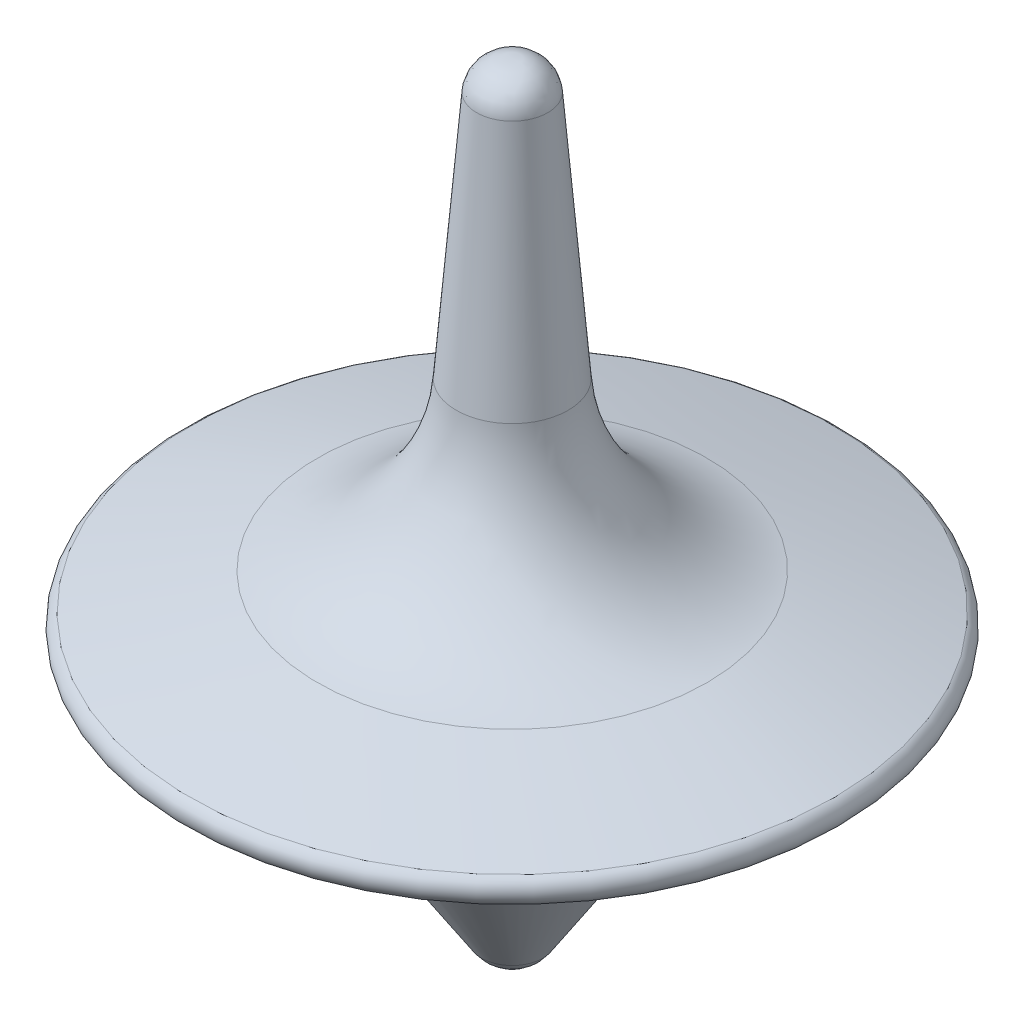
ISO-10303-21;
HEADER;
FILE_DESCRIPTION(('STEP AP214'),'2;1');
FILE_NAME('part.step','',(''),(''),'','','');
FILE_SCHEMA(('AUTOMOTIVE_DESIGN { 1 0 10303 214 1 1 1 1 }'));
ENDSEC;
DATA;
#1=APPLICATION_CONTEXT('core data for automotive mechanical design processes');
#2=APPLICATION_PROTOCOL_DEFINITION('international standard','automotive_design',2000,#1);
#3=PRODUCT_CONTEXT('',#1,'mechanical');
#4=PRODUCT('Part','Part','',(#3));
#5=PRODUCT_RELATED_PRODUCT_CATEGORY('part','',(#4));
#6=PRODUCT_DEFINITION_FORMATION('','',#4);
#7=PRODUCT_DEFINITION_CONTEXT('part definition',#1,'design');
#8=PRODUCT_DEFINITION('design','',#6,#7);
#9=PRODUCT_DEFINITION_SHAPE('','',#8);
#10=(LENGTH_UNIT() NAMED_UNIT(*) SI_UNIT(.MILLI.,.METRE.));
#11=(NAMED_UNIT(*) PLANE_ANGLE_UNIT() SI_UNIT($,.RADIAN.));
#12=(NAMED_UNIT(*) SI_UNIT($,.STERADIAN.) SOLID_ANGLE_UNIT());
#13=UNCERTAINTY_MEASURE_WITH_UNIT(LENGTH_MEASURE(1.E-05),#10,'distance_accuracy_value','');
#14=(GEOMETRIC_REPRESENTATION_CONTEXT(3) GLOBAL_UNCERTAINTY_ASSIGNED_CONTEXT((#13)) GLOBAL_UNIT_ASSIGNED_CONTEXT((#10,
#11,#12)) REPRESENTATION_CONTEXT('',''));
#15=CARTESIAN_POINT('',(0.,0.,0.));
#16=DIRECTION('',(0.,0.,1.));
#17=DIRECTION('',(1.,0.,0.));
#18=AXIS2_PLACEMENT_3D('',#15,#16,#17);
#19=CARTESIAN_POINT('',(0.89894834613798,-15.8283438948679,0.));
#20=DIRECTION('',(0.,0.,-1.));
#21=DIRECTION('',(1.,0.,0.));
#22=AXIS2_PLACEMENT_3D('',#19,#20,#21);
#23=CIRCLE('',#22,1.71);
#24=TRIMMED_CURVE('',#23,(PARAMETER_VALUE(-1.50196575874128)),
(PARAMETER_VALUE(1.50196575874128)),.T.,.PARAMETER.);
#25=CARTESIAN_POINT('',(1.01655570246413,-15.8283438948679,0.));
#26=DIRECTION('',(0.,-1.,0.));
#27=AXIS1_PLACEMENT('',#25,#26);
#28=SURFACE_OF_REVOLUTION('',#24,#27);
#29=CARTESIAN_POINT('',(1.01655570246413,-16.7542948055737,0.));
#30=DIRECTION('',(0.,-1.,0.));
#31=DIRECTION('',(1.,0.,0.));
#32=AXIS2_PLACEMENT_3D('',#29,#30,#31);
#33=CIRCLE('',#32,1.32);
#34=CARTESIAN_POINT('',(2.33655570246413,-16.7542948055737,0.));
#35=VERTEX_POINT('',#34);
#36=EDGE_CURVE('E78',#35,#35,#33,.T.);
#37=ORIENTED_EDGE('',*,*,#36,.T.);
#38=EDGE_LOOP('',(#37));
#39=FACE_BOUND('',#38,.T.);
#40=CARTESIAN_POINT('',(1.01655570246413,-17.5342948055737,0.));
#41=VERTEX_POINT('',#40);
#42=VERTEX_LOOP('',#41);
#43=FACE_BOUND('',#42,.T.);
#44=ADVANCED_FACE('F36',(#39,#43),#28,.T.);
#45=CARTESIAN_POINT('',(1.20580842590284,14.9290364221902,0.));
#46=DIRECTION('',(0.,0.,-1.));
#47=DIRECTION('',(1.,0.,0.));
#48=AXIS2_PLACEMENT_3D('',#45,#46,#47);
#49=CIRCLE('',#48,1.35000000000001);
#50=TRIMMED_CURVE('',#49,(PARAMETER_VALUE(-1.71144680858174)),
(PARAMETER_VALUE(1.71144680858174)),.T.,.PARAMETER.);
#51=CARTESIAN_POINT('',(1.01655570246413,14.9290364221902,0.));
#52=DIRECTION('',(0.,-1.,0.));
#53=AXIS1_PLACEMENT('',#51,#52);
#54=SURFACE_OF_REVOLUTION('',#50,#53);
#55=CARTESIAN_POINT('',(1.01655570246413,16.2657051944263,0.));
#56=VERTEX_POINT('',#55);
#57=VERTEX_LOOP('',#56);
#58=FACE_BOUND('',#57,.T.);
#59=CARTESIAN_POINT('',(1.01655570246413,15.0068283711998,0.));
#60=DIRECTION('',(0.,-1.,0.));
#61=DIRECTION('',(1.,0.,0.));
#62=AXIS2_PLACEMENT_3D('',#59,#60,#61);
#63=CIRCLE('',#62,1.5370095311267);
#64=CARTESIAN_POINT('',(2.55356523359083,15.0068283711998,0.));
#65=VERTEX_POINT('',#64);
#66=EDGE_CURVE('E11',#65,#65,#63,.T.);
#67=ORIENTED_EDGE('',*,*,#66,.F.);
#68=EDGE_LOOP('',(#67));
#69=FACE_BOUND('',#68,.T.);
#70=ADVANCED_FACE('F49',(#58,#69),#54,.T.);
#71=CARTESIAN_POINT('',(1.01655570246414,27.6840348764537,0.));
#72=DIRECTION('',(0.,-1.,0.));
#73=DIRECTION('',(1.,0.,0.));
#74=AXIS2_PLACEMENT_3D('',#71,#72,#73);
#75=TOROIDAL_SURFACE('',#74,221.171452265465,220.);
#76=ORIENTED_EDGE('',*,*,#66,.T.);
#77=EDGE_LOOP('',(#76));
#78=FACE_BOUND('',#77,.T.);
#79=CARTESIAN_POINT('',(1.01655570246413,4.30682837119974,0.));
#80=DIRECTION('',(0.,-1.,0.));
#81=DIRECTION('',(1.,0.,0.));
#82=AXIS2_PLACEMENT_3D('',#79,#80,#81);
#83=CIRCLE('',#82,2.41700953112671);
#84=CARTESIAN_POINT('',(3.43356523359084,4.30682837119974,0.));
#85=VERTEX_POINT('',#84);
#86=EDGE_CURVE('E43',#85,#85,#83,.T.);
#87=ORIENTED_EDGE('',*,*,#86,.F.);
#88=EDGE_LOOP('',(#87));
#89=FACE_BOUND('',#88,.T.);
#90=ADVANCED_FACE('F52',(#78,#89),#75,.F.);
#91=CARTESIAN_POINT('',(1.01655570246413,4.85767264637093,0.));
#92=DIRECTION('',(0.,-1.,0.));
#93=DIRECTION('',(1.,0.,0.));
#94=AXIS2_PLACEMENT_3D('',#91,#92,#93);
#95=TOROIDAL_SURFACE('',#94,10.3980226613321,8.);
#96=ORIENTED_EDGE('',*,*,#86,.T.);
#97=EDGE_LOOP('',(#96));
#98=FACE_BOUND('',#97,.T.);
#99=CARTESIAN_POINT('',(1.01655570246413,-2.89317162880024,0.));
#100=DIRECTION('',(0.,-1.,0.));
#101=DIRECTION('',(1.,0.,0.));
#102=AXIS2_PLACEMENT_3D('',#99,#100,#101);
#103=CIRCLE('',#102,8.41700953112671);
#104=CARTESIAN_POINT('',(9.43356523359084,-2.89317162880024,0.));
#105=VERTEX_POINT('',#104);
#106=EDGE_CURVE('E62',#105,#105,#103,.T.);
#107=ORIENTED_EDGE('',*,*,#106,.F.);
#108=EDGE_LOOP('',(#107));
#109=FACE_BOUND('',#108,.T.);
#110=ADVANCED_FACE('F57',(#98,#109),#95,.F.);
#111=CARTESIAN_POINT('',(1.01655570246415,-126.549710256872,0.));
#112=DIRECTION('',(0.,-1.,0.));
#113=DIRECTION('',(1.,0.,0.));
#114=AXIS2_PLACEMENT_3D('',#111,#112,#113);
#115=DEGENERATE_TOROIDAL_SURFACE('',#114,23.463242264057,127.7,.F.);
#116=ORIENTED_EDGE('',*,*,#106,.T.);
#117=EDGE_LOOP('',(#116));
#118=FACE_BOUND('',#117,.T.);
#119=CARTESIAN_POINT('',(1.01655570246413,-4.44317162880025,0.));
#120=DIRECTION('',(0.,-1.,0.));
#121=DIRECTION('',(1.,0.,0.));
#122=AXIS2_PLACEMENT_3D('',#119,#120,#121);
#123=CIRCLE('',#122,13.9170095311267);
#124=CARTESIAN_POINT('',(14.9335652335908,-4.44317162880024,0.));
#125=VERTEX_POINT('',#124);
#126=EDGE_CURVE('E64',#125,#125,#123,.T.);
#127=ORIENTED_EDGE('',*,*,#126,.F.);
#128=EDGE_LOOP('',(#127));
#129=FACE_BOUND('',#128,.T.);
#130=ADVANCED_FACE('F111',(#118,#129),#115,.F.);
#131=CARTESIAN_POINT('',(1.01655570246413,-4.99979513300387,0.));
#132=DIRECTION('',(0.,-1.,0.));
#133=DIRECTION('',(1.,0.,0.));
#134=AXIS2_PLACEMENT_3D('',#131,#132,#133);
#135=TOROIDAL_SURFACE('',#134,13.6219328045486,0.630000000000001);
#136=ORIENTED_EDGE('',*,*,#126,.T.);
#137=EDGE_LOOP('',(#136));
#138=FACE_BOUND('',#137,.T.);
#139=CARTESIAN_POINT('',(1.01655570246413,-5.62429480557371,0.));
#140=DIRECTION('',(0.,-1.,0.));
#141=DIRECTION('',(1.,0.,0.));
#142=AXIS2_PLACEMENT_3D('',#139,#140,#141);
#143=CIRCLE('',#142,13.705);
#144=CARTESIAN_POINT('',(14.7215557024641,-5.6242948055737,0.));
#145=VERTEX_POINT('',#144);
#146=EDGE_CURVE('E69',#145,#145,#143,.T.);
#147=ORIENTED_EDGE('',*,*,#146,.F.);
#148=EDGE_LOOP('',(#147));
#149=FACE_BOUND('',#148,.T.);
#150=ADVANCED_FACE('F118',(#138,#149),#135,.T.);
#151=CARTESIAN_POINT('',(1.01655570246414,-62.8788092176888,0.));
#152=DIRECTION('',(0.,-1.,0.));
#153=DIRECTION('',(1.,0.,0.));
#154=AXIS2_PLACEMENT_3D('',#151,#152,#153);
#155=DEGENERATE_TOROIDAL_SURFACE('',#154,31.64714534087,60.,.T.);
#156=ORIENTED_EDGE('',*,*,#146,.T.);
#157=EDGE_LOOP('',(#156));
#158=FACE_BOUND('',#157,.T.);
#159=CARTESIAN_POINT('',(1.01655570246413,-7.0742948055737,0.));
#160=DIRECTION('',(0.,-1.,0.));
#161=DIRECTION('',(1.,0.,0.));
#162=AXIS2_PLACEMENT_3D('',#159,#160,#161);
#163=CIRCLE('',#162,9.60500000000001);
#164=CARTESIAN_POINT('',(10.6215557024641,-7.0742948055737,0.));
#165=VERTEX_POINT('',#164);
#166=EDGE_CURVE('E72',#165,#165,#163,.T.);
#167=ORIENTED_EDGE('',*,*,#166,.F.);
#168=EDGE_LOOP('',(#167));
#169=FACE_BOUND('',#168,.T.);
#170=ADVANCED_FACE('F91',(#158,#169),#155,.F.);
#171=CARTESIAN_POINT('',(1.01655570246413,-14.633890511177,0.));
#172=DIRECTION('',(0.,-1.,0.));
#173=DIRECTION('',(1.,0.,0.));
#174=AXIS2_PLACEMENT_3D('',#171,#172,#173);
#175=TOROIDAL_SURFACE('',#174,12.2227304612631,8.);
#176=ORIENTED_EDGE('',*,*,#166,.T.);
#177=EDGE_LOOP('',(#176));
#178=FACE_BOUND('',#177,.T.);
#179=CARTESIAN_POINT('',(1.01655570246413,-10.3442948055737,0.));
#180=DIRECTION('',(0.,-1.,0.));
#181=DIRECTION('',(1.,0.,0.));
#182=AXIS2_PLACEMENT_3D('',#179,#180,#181);
#183=CIRCLE('',#182,5.47);
#184=CARTESIAN_POINT('',(6.48655570246414,-10.3442948055737,0.));
#185=VERTEX_POINT('',#184);
#186=EDGE_CURVE('E75',#185,#185,#183,.T.);
#187=ORIENTED_EDGE('',*,*,#186,.F.);
#188=EDGE_LOOP('',(#187));
#189=FACE_BOUND('',#188,.T.);
#190=ADVANCED_FACE('F85',(#178,#189),#175,.F.);
#191=CARTESIAN_POINT('',(1.01655570246412,29.8786378427254,0.));
#192=DIRECTION('',(0.,-1.,0.));
#193=DIRECTION('',(1.,0.,0.));
#194=AXIS2_PLACEMENT_3D('',#191,#192,#193);
#195=DEGENERATE_TOROIDAL_SURFACE('',#194,63.6828429579753,80.,.F.);
#196=ORIENTED_EDGE('',*,*,#186,.T.);
#197=EDGE_LOOP('',(#196));
#198=FACE_BOUND('',#197,.T.);
#199=ORIENTED_EDGE('',*,*,#36,.F.);
#200=EDGE_LOOP('',(#199));
#201=FACE_BOUND('',#200,.T.);
#202=ADVANCED_FACE('F83',(#198,#201),#195,.F.);
#203=CLOSED_SHELL('',(#44,#70,#90,#110,#130,#150,#170,#190,#202));
#204=MANIFOLD_SOLID_BREP('B2',#203);
#205=ADVANCED_BREP_SHAPE_REPRESENTATION('',(#18,#204),#14);
#206=SHAPE_DEFINITION_REPRESENTATION(#9,#205);
ENDSEC;
END-ISO-10303-21;
